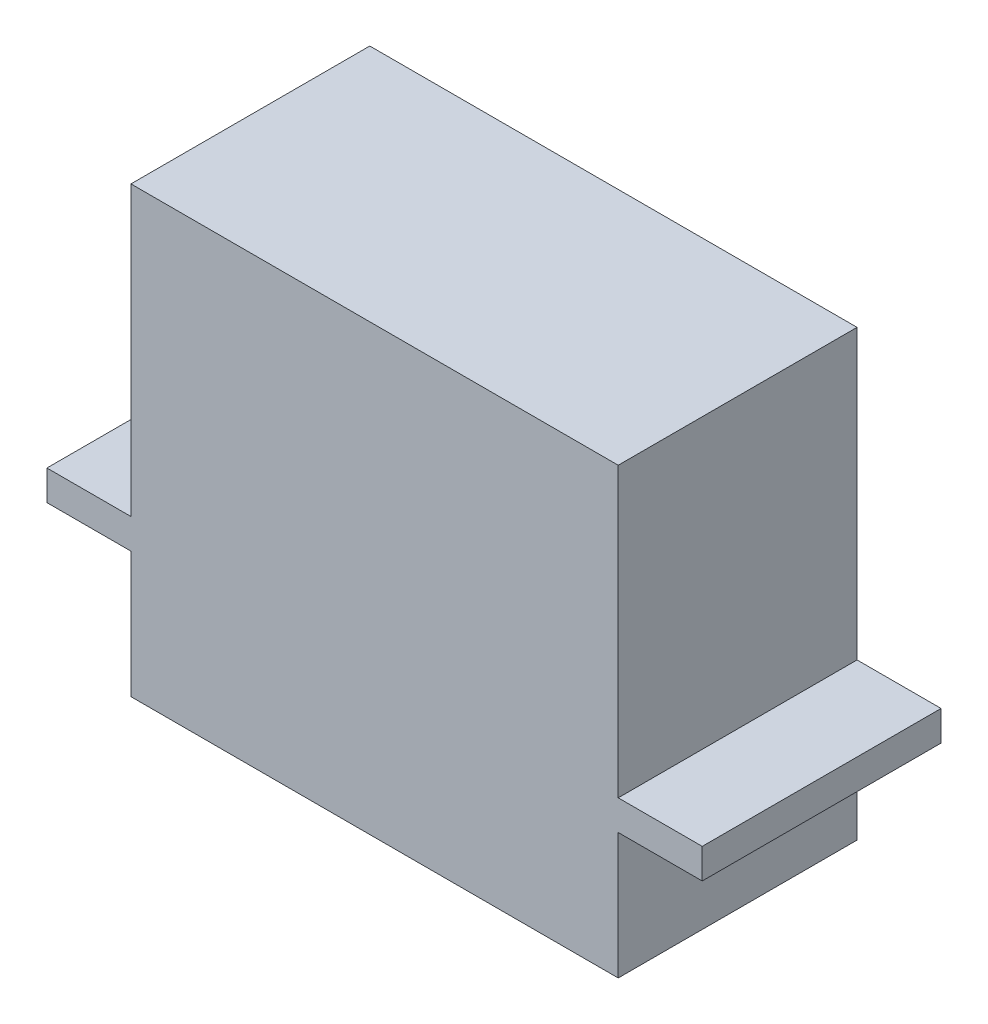
ISO-10303-21;
HEADER;
FILE_DESCRIPTION(('STEP AP214'),'2;1');
FILE_NAME('part.step','',(''),(''),'','','');
FILE_SCHEMA(('AUTOMOTIVE_DESIGN { 1 0 10303 214 1 1 1 1 }'));
ENDSEC;
DATA;
#1=APPLICATION_CONTEXT('core data for automotive mechanical design processes');
#2=APPLICATION_PROTOCOL_DEFINITION('international standard','automotive_design',2000,#1);
#3=PRODUCT_CONTEXT('',#1,'mechanical');
#4=PRODUCT('Part','Part','',(#3));
#5=PRODUCT_RELATED_PRODUCT_CATEGORY('part','',(#4));
#6=PRODUCT_DEFINITION_FORMATION('','',#4);
#7=PRODUCT_DEFINITION_CONTEXT('part definition',#1,'design');
#8=PRODUCT_DEFINITION('design','',#6,#7);
#9=PRODUCT_DEFINITION_SHAPE('','',#8);
#10=(LENGTH_UNIT() NAMED_UNIT(*) SI_UNIT(.MILLI.,.METRE.));
#11=(NAMED_UNIT(*) PLANE_ANGLE_UNIT() SI_UNIT($,.RADIAN.));
#12=(NAMED_UNIT(*) SI_UNIT($,.STERADIAN.) SOLID_ANGLE_UNIT());
#13=UNCERTAINTY_MEASURE_WITH_UNIT(LENGTH_MEASURE(1.E-05),#10,'distance_accuracy_value','');
#14=(GEOMETRIC_REPRESENTATION_CONTEXT(3) GLOBAL_UNCERTAINTY_ASSIGNED_CONTEXT((#13)) GLOBAL_UNIT_ASSIGNED_CONTEXT((#10,
#11,#12)) REPRESENTATION_CONTEXT('',''));
#15=CARTESIAN_POINT('',(0.,0.,0.));
#16=DIRECTION('',(0.,0.,1.));
#17=DIRECTION('',(1.,0.,0.));
#18=AXIS2_PLACEMENT_3D('',#15,#16,#17);
#19=CARTESIAN_POINT('',(35.5,40.,-94.95));
#20=DIRECTION('',(1.,0.,0.));
#21=DIRECTION('',(0.,1.,0.));
#22=AXIS2_PLACEMENT_3D('',#19,#20,#21);
#23=PLANE('',#22);
#24=DIRECTION('',(0.,0.,1.));
#25=VECTOR('',#24,1.);
#26=CARTESIAN_POINT('',(35.5,40.,-94.95));
#27=LINE('',#26,#25);
#28=CARTESIAN_POINT('',(35.5,40.,-94.95));
#29=VERTEX_POINT('',#28);
#30=CARTESIAN_POINT('',(35.5,40.,-75.05));
#31=VERTEX_POINT('',#30);
#32=EDGE_CURVE('E172',#29,#31,#27,.T.);
#33=ORIENTED_EDGE('',*,*,#32,.T.);
#34=DIRECTION('',(0.,1.,0.));
#35=VECTOR('',#34,1.);
#36=CARTESIAN_POINT('',(35.5,40.,-75.05));
#37=LINE('',#36,#35);
#38=CARTESIAN_POINT('',(35.5,42.5,-75.05));
#39=VERTEX_POINT('',#38);
#40=EDGE_CURVE('E197',#31,#39,#37,.T.);
#41=ORIENTED_EDGE('',*,*,#40,.T.);
#42=DIRECTION('',(0.,0.,1.));
#43=VECTOR('',#42,1.);
#44=CARTESIAN_POINT('',(35.5,42.5,-94.95));
#45=LINE('',#44,#43);
#46=CARTESIAN_POINT('',(35.5,42.5,-94.95));
#47=VERTEX_POINT('',#46);
#48=EDGE_CURVE('E11',#47,#39,#45,.T.);
#49=ORIENTED_EDGE('',*,*,#48,.F.);
#50=DIRECTION('',(0.,1.,0.));
#51=VECTOR('',#50,1.);
#52=CARTESIAN_POINT('',(35.5,40.,-94.95));
#53=LINE('',#52,#51);
#54=EDGE_CURVE('E248',#29,#47,#53,.T.);
#55=ORIENTED_EDGE('',*,*,#54,.F.);
#56=EDGE_LOOP('',(#33,#41,#49,#55));
#57=FACE_BOUND('',#56,.T.);
#58=ADVANCED_FACE('F17',(#57),#23,.F.);
#59=CARTESIAN_POINT('',(62.8,42.5,-85.));
#60=DIRECTION('',(0.,1.,0.));
#61=DIRECTION('',(0.,0.,-1.));
#62=AXIS2_PLACEMENT_3D('',#59,#60,#61);
#63=PLANE('',#62);
#64=ORIENTED_EDGE('',*,*,#48,.T.);
#65=DIRECTION('',(1.,0.,0.));
#66=VECTOR('',#65,1.);
#67=CARTESIAN_POINT('',(35.5,42.5,-75.05));
#68=LINE('',#67,#66);
#69=CARTESIAN_POINT('',(42.5,42.5,-75.05));
#70=VERTEX_POINT('',#69);
#71=EDGE_CURVE('E195',#39,#70,#68,.T.);
#72=ORIENTED_EDGE('',*,*,#71,.T.);
#73=DIRECTION('',(0.,0.,1.));
#74=VECTOR('',#73,1.);
#75=CARTESIAN_POINT('',(42.5,42.5,-89.975));
#76=LINE('',#75,#74);
#77=CARTESIAN_POINT('',(42.5,42.5,-94.95));
#78=VERTEX_POINT('',#77);
#79=EDGE_CURVE('E27',#78,#70,#76,.T.);
#80=ORIENTED_EDGE('',*,*,#79,.F.);
#81=DIRECTION('',(-1.,0.,0.));
#82=VECTOR('',#81,1.);
#83=CARTESIAN_POINT('',(90.1,42.5,-94.95));
#84=LINE('',#83,#82);
#85=EDGE_CURVE('E158',#78,#47,#84,.T.);
#86=ORIENTED_EDGE('',*,*,#85,.T.);
#87=EDGE_LOOP('',(#64,#72,#80,#86));
#88=FACE_BOUND('',#87,.T.);
#89=ADVANCED_FACE('F19',(#88),#63,.T.);
#90=CARTESIAN_POINT('',(42.5,29.5,-94.95));
#91=DIRECTION('',(1.,0.,0.));
#92=DIRECTION('',(0.,1.,0.));
#93=AXIS2_PLACEMENT_3D('',#90,#91,#92);
#94=PLANE('',#93);
#95=DIRECTION('',(0.,1.,0.));
#96=VECTOR('',#95,1.);
#97=CARTESIAN_POINT('',(42.5,29.5,-75.05));
#98=LINE('',#97,#96);
#99=CARTESIAN_POINT('',(42.5,66.5,-75.05));
#100=VERTEX_POINT('',#99);
#101=EDGE_CURVE('E187',#70,#100,#98,.T.);
#102=ORIENTED_EDGE('',*,*,#101,.T.);
#103=DIRECTION('',(0.,0.,1.));
#104=VECTOR('',#103,1.);
#105=CARTESIAN_POINT('',(42.5,66.5,-94.95));
#106=LINE('',#105,#104);
#107=CARTESIAN_POINT('',(42.5,66.5,-94.95));
#108=VERTEX_POINT('',#107);
#109=EDGE_CURVE('E136',#108,#100,#106,.T.);
#110=ORIENTED_EDGE('',*,*,#109,.F.);
#111=DIRECTION('',(0.,1.,0.));
#112=VECTOR('',#111,1.);
#113=CARTESIAN_POINT('',(42.5,29.5,-94.95));
#114=LINE('',#113,#112);
#115=EDGE_CURVE('E151',#78,#108,#114,.T.);
#116=ORIENTED_EDGE('',*,*,#115,.F.);
#117=ORIENTED_EDGE('',*,*,#79,.T.);
#118=EDGE_LOOP('',(#102,#110,#116,#117));
#119=FACE_BOUND('',#118,.T.);
#120=ADVANCED_FACE('F186',(#119),#94,.F.);
#121=CARTESIAN_POINT('',(62.8,66.5,-85.));
#122=DIRECTION('',(0.,1.,0.));
#123=DIRECTION('',(0.,0.,-1.));
#124=AXIS2_PLACEMENT_3D('',#121,#122,#123);
#125=PLANE('',#124);
#126=DIRECTION('',(1.,0.,0.));
#127=VECTOR('',#126,1.);
#128=CARTESIAN_POINT('',(42.5,66.5,-75.05));
#129=LINE('',#128,#127);
#130=CARTESIAN_POINT('',(83.1,66.5,-75.05));
#131=VERTEX_POINT('',#130);
#132=EDGE_CURVE('E131',#100,#131,#129,.T.);
#133=ORIENTED_EDGE('',*,*,#132,.T.);
#134=DIRECTION('',(0.,0.,-1.));
#135=VECTOR('',#134,1.);
#136=CARTESIAN_POINT('',(83.1,66.5,-75.05));
#137=LINE('',#136,#135);
#138=CARTESIAN_POINT('',(83.1,66.5,-94.95));
#139=VERTEX_POINT('',#138);
#140=EDGE_CURVE('E123',#131,#139,#137,.T.);
#141=ORIENTED_EDGE('',*,*,#140,.T.);
#142=DIRECTION('',(-1.,0.,0.));
#143=VECTOR('',#142,1.);
#144=CARTESIAN_POINT('',(83.1,66.5,-94.95));
#145=LINE('',#144,#143);
#146=EDGE_CURVE('E128',#139,#108,#145,.T.);
#147=ORIENTED_EDGE('',*,*,#146,.T.);
#148=ORIENTED_EDGE('',*,*,#109,.T.);
#149=EDGE_LOOP('',(#133,#141,#147,#148));
#150=FACE_BOUND('',#149,.T.);
#151=ADVANCED_FACE('F124',(#150),#125,.T.);
#152=CARTESIAN_POINT('',(83.1,29.5,-75.05));
#153=DIRECTION('',(-1.,0.,0.));
#154=DIRECTION('',(0.,0.,1.));
#155=AXIS2_PLACEMENT_3D('',#152,#153,#154);
#156=PLANE('',#155);
#157=DIRECTION('',(0.,1.,0.));
#158=VECTOR('',#157,1.);
#159=CARTESIAN_POINT('',(83.1,29.5,-94.95));
#160=LINE('',#159,#158);
#161=CARTESIAN_POINT('',(83.1,42.5,-94.95));
#162=VERTEX_POINT('',#161);
#163=EDGE_CURVE('E139',#162,#139,#160,.T.);
#164=ORIENTED_EDGE('',*,*,#163,.T.);
#165=ORIENTED_EDGE('',*,*,#140,.F.);
#166=DIRECTION('',(0.,1.,0.));
#167=VECTOR('',#166,1.);
#168=CARTESIAN_POINT('',(83.1,29.5,-75.05));
#169=LINE('',#168,#167);
#170=CARTESIAN_POINT('',(83.1,42.5,-75.05));
#171=VERTEX_POINT('',#170);
#172=EDGE_CURVE('E206',#171,#131,#169,.T.);
#173=ORIENTED_EDGE('',*,*,#172,.F.);
#174=DIRECTION('',(0.,0.,-1.));
#175=VECTOR('',#174,1.);
#176=CARTESIAN_POINT('',(83.1,42.5,-80.025));
#177=LINE('',#176,#175);
#178=EDGE_CURVE('E140',#171,#162,#177,.T.);
#179=ORIENTED_EDGE('',*,*,#178,.T.);
#180=EDGE_LOOP('',(#164,#165,#173,#179));
#181=FACE_BOUND('',#180,.T.);
#182=ADVANCED_FACE('F143',(#181),#156,.F.);
#183=CARTESIAN_POINT('',(62.8,42.5,-85.));
#184=DIRECTION('',(0.,1.,0.));
#185=DIRECTION('',(0.,0.,-1.));
#186=AXIS2_PLACEMENT_3D('',#183,#184,#185);
#187=PLANE('',#186);
#188=ORIENTED_EDGE('',*,*,#178,.F.);
#189=DIRECTION('',(1.,0.,0.));
#190=VECTOR('',#189,1.);
#191=CARTESIAN_POINT('',(35.5,42.5,-75.05));
#192=LINE('',#191,#190);
#193=CARTESIAN_POINT('',(90.1,42.5,-75.05));
#194=VERTEX_POINT('',#193);
#195=EDGE_CURVE('E279',#171,#194,#192,.T.);
#196=ORIENTED_EDGE('',*,*,#195,.T.);
#197=DIRECTION('',(0.,0.,-1.));
#198=VECTOR('',#197,1.);
#199=CARTESIAN_POINT('',(90.1,42.5,-75.05));
#200=LINE('',#199,#198);
#201=CARTESIAN_POINT('',(90.1,42.5,-94.95));
#202=VERTEX_POINT('',#201);
#203=EDGE_CURVE('E51',#194,#202,#200,.T.);
#204=ORIENTED_EDGE('',*,*,#203,.T.);
#205=DIRECTION('',(-1.,0.,0.));
#206=VECTOR('',#205,1.);
#207=CARTESIAN_POINT('',(90.1,42.5,-94.95));
#208=LINE('',#207,#206);
#209=EDGE_CURVE('E144',#202,#162,#208,.T.);
#210=ORIENTED_EDGE('',*,*,#209,.T.);
#211=EDGE_LOOP('',(#188,#196,#204,#210));
#212=FACE_BOUND('',#211,.T.);
#213=ADVANCED_FACE('F283',(#212),#187,.T.);
#214=CARTESIAN_POINT('',(90.1,40.,-75.05));
#215=DIRECTION('',(-1.,0.,0.));
#216=DIRECTION('',(0.,0.,1.));
#217=AXIS2_PLACEMENT_3D('',#214,#215,#216);
#218=PLANE('',#217);
#219=DIRECTION('',(0.,0.,-1.));
#220=VECTOR('',#219,1.);
#221=CARTESIAN_POINT('',(90.1,40.,-75.05));
#222=LINE('',#221,#220);
#223=CARTESIAN_POINT('',(90.1,40.,-75.05));
#224=VERTEX_POINT('',#223);
#225=CARTESIAN_POINT('',(90.1,40.,-94.95));
#226=VERTEX_POINT('',#225);
#227=EDGE_CURVE('E36',#224,#226,#222,.T.);
#228=ORIENTED_EDGE('',*,*,#227,.T.);
#229=DIRECTION('',(0.,1.,0.));
#230=VECTOR('',#229,1.);
#231=CARTESIAN_POINT('',(90.1,40.,-94.95));
#232=LINE('',#231,#230);
#233=EDGE_CURVE('E163',#226,#202,#232,.T.);
#234=ORIENTED_EDGE('',*,*,#233,.T.);
#235=ORIENTED_EDGE('',*,*,#203,.F.);
#236=DIRECTION('',(0.,1.,0.));
#237=VECTOR('',#236,1.);
#238=CARTESIAN_POINT('',(90.1,40.,-75.05));
#239=LINE('',#238,#237);
#240=EDGE_CURVE('E271',#224,#194,#239,.T.);
#241=ORIENTED_EDGE('',*,*,#240,.F.);
#242=EDGE_LOOP('',(#228,#234,#235,#241));
#243=FACE_BOUND('',#242,.T.);
#244=ADVANCED_FACE('F286',(#243),#218,.F.);
#245=CARTESIAN_POINT('',(62.8,40.,-85.));
#246=DIRECTION('',(0.,1.,0.));
#247=DIRECTION('',(0.,0.,-1.));
#248=AXIS2_PLACEMENT_3D('',#245,#246,#247);
#249=PLANE('',#248);
#250=DIRECTION('',(-1.,0.,0.));
#251=VECTOR('',#250,1.);
#252=CARTESIAN_POINT('',(90.1,40.,-94.95));
#253=LINE('',#252,#251);
#254=CARTESIAN_POINT('',(42.5,40.,-94.95));
#255=VERTEX_POINT('',#254);
#256=EDGE_CURVE('E243',#255,#29,#253,.T.);
#257=ORIENTED_EDGE('',*,*,#256,.F.);
#258=DIRECTION('',(0.,0.,1.));
#259=VECTOR('',#258,1.);
#260=CARTESIAN_POINT('',(42.5,40.,-89.975));
#261=LINE('',#260,#259);
#262=CARTESIAN_POINT('',(42.5,40.,-75.05));
#263=VERTEX_POINT('',#262);
#264=EDGE_CURVE('E225',#255,#263,#261,.T.);
#265=ORIENTED_EDGE('',*,*,#264,.T.);
#266=DIRECTION('',(1.,0.,0.));
#267=VECTOR('',#266,1.);
#268=CARTESIAN_POINT('',(35.5,40.,-75.05));
#269=LINE('',#268,#267);
#270=EDGE_CURVE('E215',#31,#263,#269,.T.);
#271=ORIENTED_EDGE('',*,*,#270,.F.);
#272=ORIENTED_EDGE('',*,*,#32,.F.);
#273=EDGE_LOOP('',(#257,#265,#271,#272));
#274=FACE_BOUND('',#273,.T.);
#275=ADVANCED_FACE('F485',(#274),#249,.F.);
#276=CARTESIAN_POINT('',(62.8,40.,-85.));
#277=DIRECTION('',(0.,1.,0.));
#278=DIRECTION('',(0.,0.,-1.));
#279=AXIS2_PLACEMENT_3D('',#276,#277,#278);
#280=PLANE('',#279);
#281=DIRECTION('',(-1.,0.,0.));
#282=VECTOR('',#281,1.);
#283=CARTESIAN_POINT('',(90.1,40.,-94.95));
#284=LINE('',#283,#282);
#285=CARTESIAN_POINT('',(83.1,40.,-94.95));
#286=VERTEX_POINT('',#285);
#287=EDGE_CURVE('E170',#226,#286,#284,.T.);
#288=ORIENTED_EDGE('',*,*,#287,.F.);
#289=ORIENTED_EDGE('',*,*,#227,.F.);
#290=DIRECTION('',(1.,0.,0.));
#291=VECTOR('',#290,1.);
#292=CARTESIAN_POINT('',(35.5,40.,-75.05));
#293=LINE('',#292,#291);
#294=CARTESIAN_POINT('',(83.1,40.,-75.05));
#295=VERTEX_POINT('',#294);
#296=EDGE_CURVE('E270',#295,#224,#293,.T.);
#297=ORIENTED_EDGE('',*,*,#296,.F.);
#298=DIRECTION('',(0.,0.,-1.));
#299=VECTOR('',#298,1.);
#300=CARTESIAN_POINT('',(83.1,40.,-80.025));
#301=LINE('',#300,#299);
#302=EDGE_CURVE('E217',#295,#286,#301,.T.);
#303=ORIENTED_EDGE('',*,*,#302,.T.);
#304=EDGE_LOOP('',(#288,#289,#297,#303));
#305=FACE_BOUND('',#304,.T.);
#306=ADVANCED_FACE('F295',(#305),#280,.F.);
#307=CARTESIAN_POINT('',(83.1,29.5,-94.95));
#308=DIRECTION('',(0.,0.,1.));
#309=DIRECTION('',(0.,-1.,0.));
#310=AXIS2_PLACEMENT_3D('',#307,#308,#309);
#311=PLANE('',#310);
#312=DIRECTION('',(0.,1.,0.));
#313=VECTOR('',#312,1.);
#314=CARTESIAN_POINT('',(42.5,29.5,-94.95));
#315=LINE('',#314,#313);
#316=CARTESIAN_POINT('',(42.5,29.5,-94.95));
#317=VERTEX_POINT('',#316);
#318=EDGE_CURVE('E241',#317,#255,#315,.T.);
#319=ORIENTED_EDGE('',*,*,#318,.T.);
#320=ORIENTED_EDGE('',*,*,#256,.T.);
#321=ORIENTED_EDGE('',*,*,#54,.T.);
#322=ORIENTED_EDGE('',*,*,#85,.F.);
#323=ORIENTED_EDGE('',*,*,#115,.T.);
#324=ORIENTED_EDGE('',*,*,#146,.F.);
#325=ORIENTED_EDGE('',*,*,#163,.F.);
#326=ORIENTED_EDGE('',*,*,#209,.F.);
#327=ORIENTED_EDGE('',*,*,#233,.F.);
#328=ORIENTED_EDGE('',*,*,#287,.T.);
#329=DIRECTION('',(0.,1.,0.));
#330=VECTOR('',#329,1.);
#331=CARTESIAN_POINT('',(83.1,29.5,-94.95));
#332=LINE('',#331,#330);
#333=CARTESIAN_POINT('',(83.1,29.5,-94.95));
#334=VERTEX_POINT('',#333);
#335=EDGE_CURVE('E224',#334,#286,#332,.T.);
#336=ORIENTED_EDGE('',*,*,#335,.F.);
#337=DIRECTION('',(-1.,0.,0.));
#338=VECTOR('',#337,1.);
#339=CARTESIAN_POINT('',(83.1,29.5,-94.95));
#340=LINE('',#339,#338);
#341=EDGE_CURVE('E229',#334,#317,#340,.T.);
#342=ORIENTED_EDGE('',*,*,#341,.T.);
#343=EDGE_LOOP('',(#319,#320,#321,#322,#323,#324,#325,#326,#327,#328,#336,#342));
#344=FACE_BOUND('',#343,.T.);
#345=ADVANCED_FACE('F146',(#344),#311,.F.);
#346=CARTESIAN_POINT('',(42.5,29.5,-94.95));
#347=DIRECTION('',(1.,0.,0.));
#348=DIRECTION('',(0.,1.,0.));
#349=AXIS2_PLACEMENT_3D('',#346,#347,#348);
#350=PLANE('',#349);
#351=DIRECTION('',(0.,1.,0.));
#352=VECTOR('',#351,1.);
#353=CARTESIAN_POINT('',(42.5,29.5,-75.05));
#354=LINE('',#353,#352);
#355=CARTESIAN_POINT('',(42.5,29.5,-75.05));
#356=VERTEX_POINT('',#355);
#357=EDGE_CURVE('E213',#356,#263,#354,.T.);
#358=ORIENTED_EDGE('',*,*,#357,.T.);
#359=ORIENTED_EDGE('',*,*,#264,.F.);
#360=ORIENTED_EDGE('',*,*,#318,.F.);
#361=DIRECTION('',(0.,0.,1.));
#362=VECTOR('',#361,1.);
#363=CARTESIAN_POINT('',(42.5,29.5,-94.95));
#364=LINE('',#363,#362);
#365=EDGE_CURVE('E227',#317,#356,#364,.T.);
#366=ORIENTED_EDGE('',*,*,#365,.T.);
#367=EDGE_LOOP('',(#358,#359,#360,#366));
#368=FACE_BOUND('',#367,.T.);
#369=ADVANCED_FACE('F306',(#368),#350,.F.);
#370=CARTESIAN_POINT('',(83.1,29.5,-75.05));
#371=DIRECTION('',(-1.,0.,0.));
#372=DIRECTION('',(0.,0.,1.));
#373=AXIS2_PLACEMENT_3D('',#370,#371,#372);
#374=PLANE('',#373);
#375=ORIENTED_EDGE('',*,*,#335,.T.);
#376=ORIENTED_EDGE('',*,*,#302,.F.);
#377=DIRECTION('',(0.,1.,0.));
#378=VECTOR('',#377,1.);
#379=CARTESIAN_POINT('',(83.1,29.5,-75.05));
#380=LINE('',#379,#378);
#381=CARTESIAN_POINT('',(83.1,29.5,-75.05));
#382=VERTEX_POINT('',#381);
#383=EDGE_CURVE('E266',#382,#295,#380,.T.);
#384=ORIENTED_EDGE('',*,*,#383,.F.);
#385=DIRECTION('',(0.,0.,-1.));
#386=VECTOR('',#385,1.);
#387=CARTESIAN_POINT('',(83.1,29.5,-75.05));
#388=LINE('',#387,#386);
#389=EDGE_CURVE('E235',#382,#334,#388,.T.);
#390=ORIENTED_EDGE('',*,*,#389,.T.);
#391=EDGE_LOOP('',(#375,#376,#384,#390));
#392=FACE_BOUND('',#391,.T.);
#393=ADVANCED_FACE('F311',(#392),#374,.F.);
#394=CARTESIAN_POINT('',(62.8,29.5,-85.));
#395=DIRECTION('',(0.,1.,0.));
#396=DIRECTION('',(0.,0.,-1.));
#397=AXIS2_PLACEMENT_3D('',#394,#395,#396);
#398=PLANE('',#397);
#399=ORIENTED_EDGE('',*,*,#365,.F.);
#400=ORIENTED_EDGE('',*,*,#341,.F.);
#401=ORIENTED_EDGE('',*,*,#389,.F.);
#402=DIRECTION('',(1.,0.,0.));
#403=VECTOR('',#402,1.);
#404=CARTESIAN_POINT('',(42.5,29.5,-75.05));
#405=LINE('',#404,#403);
#406=EDGE_CURVE('E220',#356,#382,#405,.T.);
#407=ORIENTED_EDGE('',*,*,#406,.F.);
#408=EDGE_LOOP('',(#399,#400,#401,#407));
#409=FACE_BOUND('',#408,.T.);
#410=ADVANCED_FACE('F315',(#409),#398,.F.);
#411=CARTESIAN_POINT('',(42.5,29.5,-75.05));
#412=DIRECTION('',(0.,0.,-1.));
#413=DIRECTION('',(-1.,0.,0.));
#414=AXIS2_PLACEMENT_3D('',#411,#412,#413);
#415=PLANE('',#414);
#416=ORIENTED_EDGE('',*,*,#383,.T.);
#417=ORIENTED_EDGE('',*,*,#296,.T.);
#418=ORIENTED_EDGE('',*,*,#240,.T.);
#419=ORIENTED_EDGE('',*,*,#195,.F.);
#420=ORIENTED_EDGE('',*,*,#172,.T.);
#421=ORIENTED_EDGE('',*,*,#132,.F.);
#422=ORIENTED_EDGE('',*,*,#101,.F.);
#423=ORIENTED_EDGE('',*,*,#71,.F.);
#424=ORIENTED_EDGE('',*,*,#40,.F.);
#425=ORIENTED_EDGE('',*,*,#270,.T.);
#426=ORIENTED_EDGE('',*,*,#357,.F.);
#427=ORIENTED_EDGE('',*,*,#406,.T.);
#428=EDGE_LOOP('',(#416,#417,#418,#419,#420,#421,#422,#423,#424,#425,#426,#427));
#429=FACE_BOUND('',#428,.T.);
#430=ADVANCED_FACE('F199',(#429),#415,.F.);
#431=CLOSED_SHELL('',(#58,#89,#120,#151,#182,#213,#244,#275,#306,#345,#369,#393,#410,#430));
#432=MANIFOLD_SOLID_BREP('B1',#431);
#433=ADVANCED_BREP_SHAPE_REPRESENTATION('',(#18,#432),#14);
#434=SHAPE_DEFINITION_REPRESENTATION(#9,#433);
ENDSEC;
END-ISO-10303-21;
